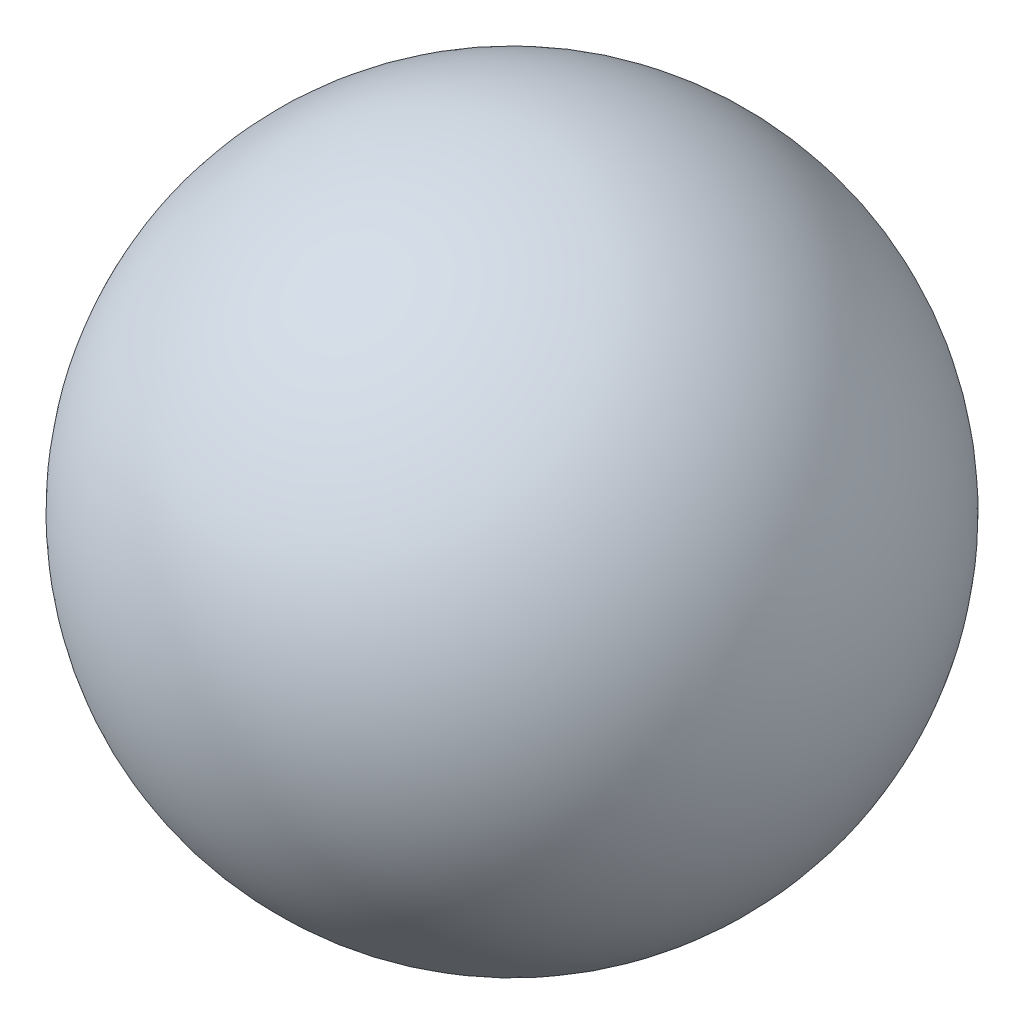
ISO-10303-21;
HEADER;
FILE_DESCRIPTION(('STEP AP214'),'2;1');
FILE_NAME('part.step','',(''),(''),'','','');
FILE_SCHEMA(('AUTOMOTIVE_DESIGN { 1 0 10303 214 1 1 1 1 }'));
ENDSEC;
DATA;
#1=APPLICATION_CONTEXT('core data for automotive mechanical design processes');
#2=APPLICATION_PROTOCOL_DEFINITION('international standard','automotive_design',2000,#1);
#3=PRODUCT_CONTEXT('',#1,'mechanical');
#4=PRODUCT('Part','Part','',(#3));
#5=PRODUCT_RELATED_PRODUCT_CATEGORY('part','',(#4));
#6=PRODUCT_DEFINITION_FORMATION('','',#4);
#7=PRODUCT_DEFINITION_CONTEXT('part definition',#1,'design');
#8=PRODUCT_DEFINITION('design','',#6,#7);
#9=PRODUCT_DEFINITION_SHAPE('','',#8);
#10=(LENGTH_UNIT() NAMED_UNIT(*) SI_UNIT(.MILLI.,.METRE.));
#11=(NAMED_UNIT(*) PLANE_ANGLE_UNIT() SI_UNIT($,.RADIAN.));
#12=(NAMED_UNIT(*) SI_UNIT($,.STERADIAN.) SOLID_ANGLE_UNIT());
#13=UNCERTAINTY_MEASURE_WITH_UNIT(LENGTH_MEASURE(1.E-05),#10,'distance_accuracy_value','');
#14=(GEOMETRIC_REPRESENTATION_CONTEXT(3) GLOBAL_UNCERTAINTY_ASSIGNED_CONTEXT((#13)) GLOBAL_UNIT_ASSIGNED_CONTEXT((#10,
#11,#12)) REPRESENTATION_CONTEXT('',''));
#15=CARTESIAN_POINT('',(0.,0.,0.));
#16=DIRECTION('',(0.,0.,1.));
#17=DIRECTION('',(1.,0.,0.));
#18=AXIS2_PLACEMENT_3D('',#15,#16,#17);
#19=CARTESIAN_POINT('',(0.,0.,0.));
#20=DIRECTION('',(-1.,0.,0.));
#21=DIRECTION('',(0.,0.,-1.));
#22=AXIS2_PLACEMENT_3D('',#19,#20,#21);
#23=SPHERICAL_SURFACE('',#22,50.8);
#24=CARTESIAN_POINT('',(-50.8,0.,0.));
#25=VERTEX_POINT('',#24);
#26=VERTEX_LOOP('',#25);
#27=FACE_BOUND('',#26,.T.);
#28=ADVANCED_FACE('F33',(#27),#23,.T.);
#29=CLOSED_SHELL('',(#28));
#30=MANIFOLD_SOLID_BREP('B2',#29);
#31=ADVANCED_BREP_SHAPE_REPRESENTATION('',(#18,#30),#14);
#32=SHAPE_DEFINITION_REPRESENTATION(#9,#31);
ENDSEC;
END-ISO-10303-21;
